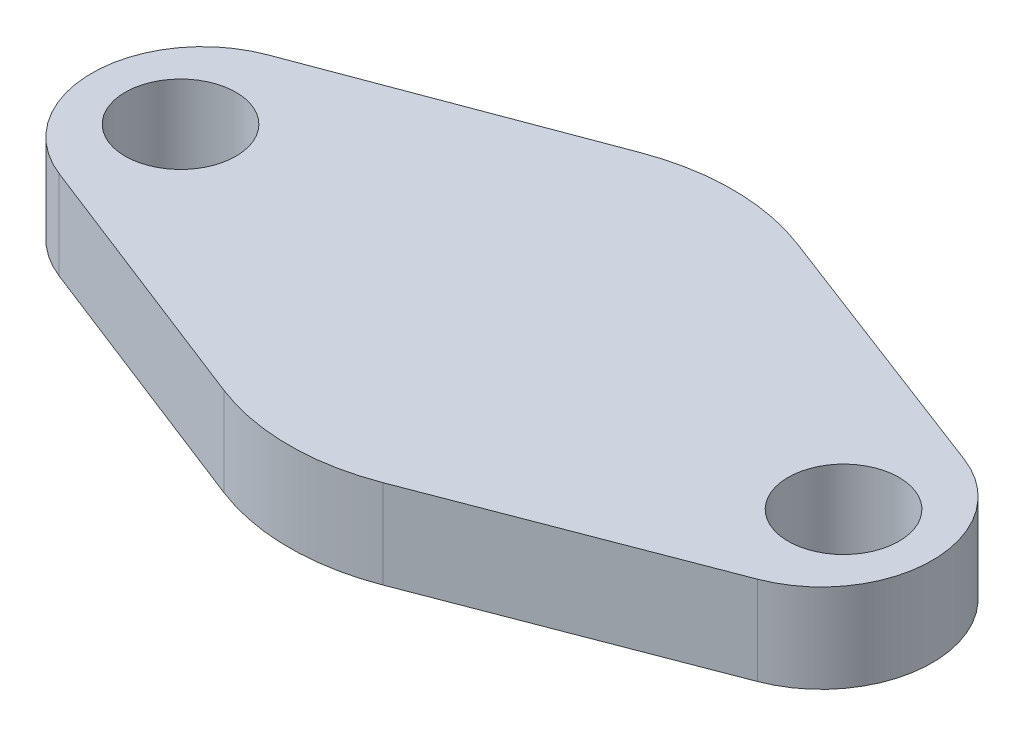
ISO-10303-21;
HEADER;
FILE_DESCRIPTION(('STEP AP214'),'2;1');
FILE_NAME('part.step','',(''),(''),'','','');
FILE_SCHEMA(('AUTOMOTIVE_DESIGN { 1 0 10303 214 1 1 1 1 }'));
ENDSEC;
DATA;
#1=APPLICATION_CONTEXT('core data for automotive mechanical design processes');
#2=APPLICATION_PROTOCOL_DEFINITION('international standard','automotive_design',2000,#1);
#3=PRODUCT_CONTEXT('',#1,'mechanical');
#4=PRODUCT('Part','Part','',(#3));
#5=PRODUCT_RELATED_PRODUCT_CATEGORY('part','',(#4));
#6=PRODUCT_DEFINITION_FORMATION('','',#4);
#7=PRODUCT_DEFINITION_CONTEXT('part definition',#1,'design');
#8=PRODUCT_DEFINITION('design','',#6,#7);
#9=PRODUCT_DEFINITION_SHAPE('','',#8);
#10=(LENGTH_UNIT() NAMED_UNIT(*) SI_UNIT(.MILLI.,.METRE.));
#11=(NAMED_UNIT(*) PLANE_ANGLE_UNIT() SI_UNIT($,.RADIAN.));
#12=(NAMED_UNIT(*) SI_UNIT($,.STERADIAN.) SOLID_ANGLE_UNIT());
#13=UNCERTAINTY_MEASURE_WITH_UNIT(LENGTH_MEASURE(1.E-05),#10,'distance_accuracy_value','');
#14=(GEOMETRIC_REPRESENTATION_CONTEXT(3) GLOBAL_UNCERTAINTY_ASSIGNED_CONTEXT((#13)) GLOBAL_UNIT_ASSIGNED_CONTEXT((#10,
#11,#12)) REPRESENTATION_CONTEXT('',''));
#15=CARTESIAN_POINT('',(0.,0.,0.));
#16=DIRECTION('',(0.,0.,1.));
#17=DIRECTION('',(1.,0.,0.));
#18=AXIS2_PLACEMENT_3D('',#15,#16,#17);
#19=CARTESIAN_POINT('',(69.9999921528156,-20.,-0.0331452222624423));
#20=DIRECTION('',(0.,1.,0.));
#21=DIRECTION('',(0.,0.,1.));
#22=AXIS2_PLACEMENT_3D('',#19,#20,#21);
#23=CYLINDRICAL_SURFACE('',#22,25.);
#24=CARTESIAN_POINT('',(69.9999921528156,0.,-0.0331452222624423));
#25=DIRECTION('',(0.,-1.,0.));
#26=DIRECTION('',(0.,0.,-1.));
#27=AXIS2_PLACEMENT_3D('',#24,#25,#26);
#28=CIRCLE('',#27,25.);
#29=CARTESIAN_POINT('',(78.9175056921311,0.,-23.3886146518441));
#30=VERTEX_POINT('',#29);
#31=CARTESIAN_POINT('',(78.9396194688102,0.,23.3138687934768));
#32=VERTEX_POINT('',#31);
#33=EDGE_CURVE('E139',#30,#32,#28,.T.);
#34=ORIENTED_EDGE('',*,*,#33,.T.);
#35=DIRECTION('',(0.,1.,0.));
#36=VECTOR('',#35,1.);
#37=CARTESIAN_POINT('',(78.9396194688102,-20.,23.3138687934768));
#38=LINE('',#37,#36);
#39=CARTESIAN_POINT('',(78.9396194688102,-20.,23.3138687934768));
#40=VERTEX_POINT('',#39);
#41=EDGE_CURVE('E11',#40,#32,#38,.T.);
#42=ORIENTED_EDGE('',*,*,#41,.F.);
#43=CARTESIAN_POINT('',(69.9999921528156,-20.,-0.0331452222624423));
#44=DIRECTION('',(0.,-1.,0.));
#45=DIRECTION('',(0.,0.,-1.));
#46=AXIS2_PLACEMENT_3D('',#43,#44,#45);
#47=CIRCLE('',#46,25.);
#48=CARTESIAN_POINT('',(78.9175056921311,-20.,-23.3886146518441));
#49=VERTEX_POINT('',#48);
#50=EDGE_CURVE('E162',#49,#40,#47,.T.);
#51=ORIENTED_EDGE('',*,*,#50,.F.);
#52=DIRECTION('',(0.,1.,0.));
#53=VECTOR('',#52,1.);
#54=CARTESIAN_POINT('',(78.9175056921311,-20.,-23.3886146518441));
#55=LINE('',#54,#53);
#56=EDGE_CURVE('E135',#49,#30,#55,.T.);
#57=ORIENTED_EDGE('',*,*,#56,.T.);
#58=EDGE_LOOP('',(#34,#42,#51,#57));
#59=FACE_BOUND('',#58,.T.);
#60=ADVANCED_FACE('F38',(#59),#23,.T.);
#61=CARTESIAN_POINT('',(17.8792546319892,-20.,46.6940280314785));
#62=DIRECTION('',(-0.357585092639783,0.,-0.933880560629569));
#63=DIRECTION('',(-0.933880560629569,0.,0.357585092639783));
#64=AXIS2_PLACEMENT_3D('',#61,#62,#63);
#65=PLANE('',#64);
#66=DIRECTION('',(-0.933880560629569,0.,0.357585092639783));
#67=VECTOR('',#66,1.);
#68=CARTESIAN_POINT('',(17.8792546319892,0.,46.6940280314785));
#69=LINE('',#68,#67);
#70=CARTESIAN_POINT('',(17.8792546319892,0.,46.6940280314785));
#71=VERTEX_POINT('',#70);
#72=EDGE_CURVE('E143',#32,#71,#69,.T.);
#73=ORIENTED_EDGE('',*,*,#72,.T.);
#74=DIRECTION('',(0.,1.,0.));
#75=VECTOR('',#74,1.);
#76=CARTESIAN_POINT('',(17.8792546319892,-20.,46.6940280314785));
#77=LINE('',#76,#75);
#78=CARTESIAN_POINT('',(17.8792546319892,-20.,46.6940280314785));
#79=VERTEX_POINT('',#78);
#80=EDGE_CURVE('E47',#79,#71,#77,.T.);
#81=ORIENTED_EDGE('',*,*,#80,.F.);
#82=DIRECTION('',(-0.933880560629569,0.,0.357585092639783));
#83=VECTOR('',#82,1.);
#84=CARTESIAN_POINT('',(17.8792546319892,-20.,46.6940280314785));
#85=LINE('',#84,#83);
#86=EDGE_CURVE('E98',#40,#79,#85,.T.);
#87=ORIENTED_EDGE('',*,*,#86,.F.);
#88=ORIENTED_EDGE('',*,*,#41,.T.);
#89=EDGE_LOOP('',(#73,#81,#87,#88));
#90=FACE_BOUND('',#89,.T.);
#91=ADVANCED_FACE('F244',(#90),#65,.F.);
#92=CARTESIAN_POINT('',(0.,-20.,0.));
#93=DIRECTION('',(0.,1.,0.));
#94=DIRECTION('',(0.,0.,1.));
#95=AXIS2_PLACEMENT_3D('',#92,#93,#94);
#96=CYLINDRICAL_SURFACE('',#95,50.);
#97=CARTESIAN_POINT('',(0.,0.,0.));
#98=DIRECTION('',(0.,-1.,0.));
#99=DIRECTION('',(0.,0.,-1.));
#100=AXIS2_PLACEMENT_3D('',#97,#98,#99);
#101=CIRCLE('',#100,50.);
#102=CARTESIAN_POINT('',(-18.1568826975564,0.,46.5867750623198));
#103=VERTEX_POINT('',#102);
#104=EDGE_CURVE('E147',#71,#103,#101,.T.);
#105=ORIENTED_EDGE('',*,*,#104,.T.);
#106=DIRECTION('',(0.,1.,0.));
#107=VECTOR('',#106,1.);
#108=CARTESIAN_POINT('',(-18.1568826975564,-20.,46.5867750623198));
#109=LINE('',#108,#107);
#110=CARTESIAN_POINT('',(-18.1568826975564,-20.,46.5867750623198));
#111=VERTEX_POINT('',#110);
#112=EDGE_CURVE('E173',#111,#103,#109,.T.);
#113=ORIENTED_EDGE('',*,*,#112,.F.);
#114=CARTESIAN_POINT('',(0.,-20.,0.));
#115=DIRECTION('',(0.,-1.,0.));
#116=DIRECTION('',(0.,0.,-1.));
#117=AXIS2_PLACEMENT_3D('',#114,#115,#116);
#118=CIRCLE('',#117,50.);
#119=EDGE_CURVE('E183',#79,#111,#118,.T.);
#120=ORIENTED_EDGE('',*,*,#119,.F.);
#121=ORIENTED_EDGE('',*,*,#80,.T.);
#122=EDGE_LOOP('',(#105,#113,#120,#121));
#123=FACE_BOUND('',#122,.T.);
#124=ADVANCED_FACE('F181',(#123),#96,.T.);
#125=CARTESIAN_POINT('',(-79.0769960781902,-20.,22.8435700198086));
#126=DIRECTION('',(0.363137653951129,0.,-0.931735501246395));
#127=DIRECTION('',(-0.931735501246395,0.,-0.363137653951129));
#128=AXIS2_PLACEMENT_3D('',#125,#126,#127);
#129=PLANE('',#128);
#130=DIRECTION('',(-0.931735501246395,0.,-0.363137653951129));
#131=VECTOR('',#130,1.);
#132=CARTESIAN_POINT('',(-79.0769960781902,0.,22.8435700198086));
#133=LINE('',#132,#131);
#134=CARTESIAN_POINT('',(-79.0769960781902,0.,22.8435700198086));
#135=VERTEX_POINT('',#134);
#136=EDGE_CURVE('E150',#103,#135,#133,.T.);
#137=ORIENTED_EDGE('',*,*,#136,.T.);
#138=DIRECTION('',(0.,1.,0.));
#139=VECTOR('',#138,1.);
#140=CARTESIAN_POINT('',(-79.0769960781902,-20.,22.8435700198086));
#141=LINE('',#140,#139);
#142=CARTESIAN_POINT('',(-79.0769960781902,-20.,22.8435700198086));
#143=VERTEX_POINT('',#142);
#144=EDGE_CURVE('E169',#143,#135,#141,.T.);
#145=ORIENTED_EDGE('',*,*,#144,.F.);
#146=DIRECTION('',(-0.931735501246395,0.,-0.363137653951129));
#147=VECTOR('',#146,1.);
#148=CARTESIAN_POINT('',(-79.0769960781902,-20.,22.8435700198086));
#149=LINE('',#148,#147);
#150=EDGE_CURVE('E196',#111,#143,#149,.T.);
#151=ORIENTED_EDGE('',*,*,#150,.F.);
#152=ORIENTED_EDGE('',*,*,#112,.T.);
#153=EDGE_LOOP('',(#137,#145,#151,#152));
#154=FACE_BOUND('',#153,.T.);
#155=ADVANCED_FACE('F191',(#154),#129,.F.);
#156=CARTESIAN_POINT('',(-69.998554729412,-20.,-0.449817511351326));
#157=DIRECTION('',(0.,1.,0.));
#158=DIRECTION('',(0.,0.,1.));
#159=AXIS2_PLACEMENT_3D('',#156,#157,#158);
#160=CYLINDRICAL_SURFACE('',#159,25.);
#161=CARTESIAN_POINT('',(-69.998554729412,0.,-0.449817511351326));
#162=DIRECTION('',(0.,-1.,0.));
#163=DIRECTION('',(0.,0.,-1.));
#164=AXIS2_PLACEMENT_3D('',#161,#162,#163);
#165=CIRCLE('',#164,25.);
#166=CARTESIAN_POINT('',(-78.7768875463001,0.,-23.8579544076518));
#167=VERTEX_POINT('',#166);
#168=EDGE_CURVE('E153',#135,#167,#165,.T.);
#169=ORIENTED_EDGE('',*,*,#168,.T.);
#170=DIRECTION('',(0.,1.,0.));
#171=VECTOR('',#170,1.);
#172=CARTESIAN_POINT('',(-78.7768875463001,-20.,-23.8579544076518));
#173=LINE('',#172,#171);
#174=CARTESIAN_POINT('',(-78.7768875463001,-20.,-23.8579544076518));
#175=VERTEX_POINT('',#174);
#176=EDGE_CURVE('E128',#175,#167,#173,.T.);
#177=ORIENTED_EDGE('',*,*,#176,.F.);
#178=CARTESIAN_POINT('',(-69.998554729412,-20.,-0.449817511351326));
#179=DIRECTION('',(0.,-1.,0.));
#180=DIRECTION('',(0.,0.,-1.));
#181=AXIS2_PLACEMENT_3D('',#178,#179,#180);
#182=CIRCLE('',#181,25.);
#183=EDGE_CURVE('E117',#143,#175,#182,.T.);
#184=ORIENTED_EDGE('',*,*,#183,.F.);
#185=ORIENTED_EDGE('',*,*,#144,.T.);
#186=EDGE_LOOP('',(#169,#177,#184,#185));
#187=FACE_BOUND('',#186,.T.);
#188=ADVANCED_FACE('F194',(#187),#160,.T.);
#189=CARTESIAN_POINT('',(-17.5566656337762,-20.,-46.816273792601));
#190=DIRECTION('',(0.351133312675524,0.,0.93632547585202));
#191=DIRECTION('',(0.93632547585202,0.,-0.351133312675524));
#192=AXIS2_PLACEMENT_3D('',#189,#190,#191);
#193=PLANE('',#192);
#194=DIRECTION('',(0.93632547585202,0.,-0.351133312675524));
#195=VECTOR('',#194,1.);
#196=CARTESIAN_POINT('',(-17.5566656337762,0.,-46.816273792601));
#197=LINE('',#196,#195);
#198=CARTESIAN_POINT('',(-17.5566656337762,0.,-46.816273792601));
#199=VERTEX_POINT('',#198);
#200=EDGE_CURVE('E126',#167,#199,#197,.T.);
#201=ORIENTED_EDGE('',*,*,#200,.T.);
#202=DIRECTION('',(0.,1.,0.));
#203=VECTOR('',#202,1.);
#204=CARTESIAN_POINT('',(-17.5566656337762,-20.,-46.816273792601));
#205=LINE('',#204,#203);
#206=CARTESIAN_POINT('',(-17.5566656337762,-20.,-46.816273792601));
#207=VERTEX_POINT('',#206);
#208=EDGE_CURVE('E123',#207,#199,#205,.T.);
#209=ORIENTED_EDGE('',*,*,#208,.F.);
#210=DIRECTION('',(0.93632547585202,0.,-0.351133312675524));
#211=VECTOR('',#210,1.);
#212=CARTESIAN_POINT('',(-17.5566656337762,-20.,-46.816273792601));
#213=LINE('',#212,#211);
#214=EDGE_CURVE('E111',#175,#207,#213,.T.);
#215=ORIENTED_EDGE('',*,*,#214,.F.);
#216=ORIENTED_EDGE('',*,*,#176,.T.);
#217=EDGE_LOOP('',(#201,#209,#215,#216));
#218=FACE_BOUND('',#217,.T.);
#219=ADVANCED_FACE('F124',(#218),#193,.F.);
#220=CARTESIAN_POINT('',(0.,-20.,0.));
#221=DIRECTION('',(0.,1.,0.));
#222=DIRECTION('',(0.,0.,1.));
#223=AXIS2_PLACEMENT_3D('',#220,#221,#222);
#224=CYLINDRICAL_SURFACE('',#223,50.);
#225=CARTESIAN_POINT('',(0.,0.,0.));
#226=DIRECTION('',(0.,-1.,0.));
#227=DIRECTION('',(0.,0.,-1.));
#228=AXIS2_PLACEMENT_3D('',#225,#226,#227);
#229=CIRCLE('',#228,50.);
#230=CARTESIAN_POINT('',(17.835027078631,0.,-46.7109388591634));
#231=VERTEX_POINT('',#230);
#232=EDGE_CURVE('E84',#199,#231,#229,.T.);
#233=ORIENTED_EDGE('',*,*,#232,.T.);
#234=DIRECTION('',(0.,1.,0.));
#235=VECTOR('',#234,1.);
#236=CARTESIAN_POINT('',(17.835027078631,-20.,-46.7109388591634));
#237=LINE('',#236,#235);
#238=CARTESIAN_POINT('',(17.835027078631,-20.,-46.7109388591634));
#239=VERTEX_POINT('',#238);
#240=EDGE_CURVE('E129',#239,#231,#237,.T.);
#241=ORIENTED_EDGE('',*,*,#240,.F.);
#242=CARTESIAN_POINT('',(0.,-20.,0.));
#243=DIRECTION('',(0.,-1.,0.));
#244=DIRECTION('',(0.,0.,-1.));
#245=AXIS2_PLACEMENT_3D('',#242,#243,#244);
#246=CIRCLE('',#245,50.);
#247=EDGE_CURVE('E115',#207,#239,#246,.T.);
#248=ORIENTED_EDGE('',*,*,#247,.F.);
#249=ORIENTED_EDGE('',*,*,#208,.T.);
#250=EDGE_LOOP('',(#233,#241,#248,#249));
#251=FACE_BOUND('',#250,.T.);
#252=ADVANCED_FACE('F131',(#251),#224,.T.);
#253=CARTESIAN_POINT('',(78.9175056921311,-20.,-23.3886146518441));
#254=DIRECTION('',(-0.35670054157262,0.,0.934218777183267));
#255=DIRECTION('',(0.934218777183267,0.,0.35670054157262));
#256=AXIS2_PLACEMENT_3D('',#253,#254,#255);
#257=PLANE('',#256);
#258=DIRECTION('',(0.934218777183267,0.,0.35670054157262));
#259=VECTOR('',#258,1.);
#260=CARTESIAN_POINT('',(78.9175056921311,0.,-23.3886146518441));
#261=LINE('',#260,#259);
#262=EDGE_CURVE('E90',#231,#30,#261,.T.);
#263=ORIENTED_EDGE('',*,*,#262,.T.);
#264=ORIENTED_EDGE('',*,*,#56,.F.);
#265=DIRECTION('',(0.934218777183267,0.,0.35670054157262));
#266=VECTOR('',#265,1.);
#267=CARTESIAN_POINT('',(78.9175056921311,-20.,-23.3886146518441));
#268=LINE('',#267,#266);
#269=EDGE_CURVE('E55',#239,#49,#268,.T.);
#270=ORIENTED_EDGE('',*,*,#269,.F.);
#271=ORIENTED_EDGE('',*,*,#240,.T.);
#272=EDGE_LOOP('',(#263,#264,#270,#271));
#273=FACE_BOUND('',#272,.T.);
#274=ADVANCED_FACE('F251',(#273),#257,.F.);
#275=CARTESIAN_POINT('',(69.9999921528156,-20.,-0.0331452222624423));
#276=DIRECTION('',(0.,-1.,0.));
#277=DIRECTION('',(0.,0.,-1.));
#278=AXIS2_PLACEMENT_3D('',#275,#276,#277);
#279=PLANE('',#278);
#280=CARTESIAN_POINT('',(-74.9980385613448,-20.,-0.481944680033792));
#281=DIRECTION('',(0.,1.,0.));
#282=DIRECTION('',(0.,0.,1.));
#283=AXIS2_PLACEMENT_3D('',#280,#281,#282);
#284=CIRCLE('',#283,12.5);
#285=CARTESIAN_POINT('',(-74.9980385613448,-20.,12.0180553199662));
#286=VERTEX_POINT('',#285);
#287=EDGE_CURVE('E144',#286,#286,#284,.T.);
#288=ORIENTED_EDGE('',*,*,#287,.T.);
#289=EDGE_LOOP('',(#288));
#290=FACE_BOUND('',#289,.T.);
#291=CARTESIAN_POINT('',(74.999578649369,-20.,-0.0355125426085293));
#292=DIRECTION('',(0.,1.,0.));
#293=DIRECTION('',(0.,0.,-1.));
#294=AXIS2_PLACEMENT_3D('',#291,#292,#293);
#295=CIRCLE('',#294,12.5);
#296=CARTESIAN_POINT('',(74.999578649369,-20.,-12.5355125426086));
#297=VERTEX_POINT('',#296);
#298=EDGE_CURVE('E210',#297,#297,#295,.T.);
#299=ORIENTED_EDGE('',*,*,#298,.T.);
#300=EDGE_LOOP('',(#299));
#301=FACE_BOUND('',#300,.T.);
#302=ORIENTED_EDGE('',*,*,#50,.T.);
#303=ORIENTED_EDGE('',*,*,#86,.T.);
#304=ORIENTED_EDGE('',*,*,#119,.T.);
#305=ORIENTED_EDGE('',*,*,#150,.T.);
#306=ORIENTED_EDGE('',*,*,#183,.T.);
#307=ORIENTED_EDGE('',*,*,#214,.T.);
#308=ORIENTED_EDGE('',*,*,#247,.T.);
#309=ORIENTED_EDGE('',*,*,#269,.T.);
#310=EDGE_LOOP('',(#302,#303,#304,#305,#306,#307,#308,#309));
#311=FACE_BOUND('',#310,.T.);
#312=ADVANCED_FACE('F113',(#290,#301,#311),#279,.T.);
#313=CARTESIAN_POINT('',(69.9999921528156,0.,-0.0331452222624423));
#314=DIRECTION('',(0.,-1.,0.));
#315=DIRECTION('',(0.,0.,-1.));
#316=AXIS2_PLACEMENT_3D('',#313,#314,#315);
#317=PLANE('',#316);
#318=CARTESIAN_POINT('',(-74.9980385613448,0.,-0.481944680033792));
#319=DIRECTION('',(0.,1.,0.));
#320=DIRECTION('',(0.,0.,1.));
#321=AXIS2_PLACEMENT_3D('',#318,#319,#320);
#322=CIRCLE('',#321,12.5);
#323=CARTESIAN_POINT('',(-74.9980385613448,0.,12.0180553199662));
#324=VERTEX_POINT('',#323);
#325=EDGE_CURVE('E214',#324,#324,#322,.T.);
#326=ORIENTED_EDGE('',*,*,#325,.F.);
#327=EDGE_LOOP('',(#326));
#328=FACE_BOUND('',#327,.T.);
#329=CARTESIAN_POINT('',(74.999578649369,0.,-0.0355125426085293));
#330=DIRECTION('',(0.,1.,0.));
#331=DIRECTION('',(0.,0.,-1.));
#332=AXIS2_PLACEMENT_3D('',#329,#330,#331);
#333=CIRCLE('',#332,12.5);
#334=CARTESIAN_POINT('',(74.999578649369,0.,-12.5355125426086));
#335=VERTEX_POINT('',#334);
#336=EDGE_CURVE('E206',#335,#335,#333,.T.);
#337=ORIENTED_EDGE('',*,*,#336,.F.);
#338=EDGE_LOOP('',(#337));
#339=FACE_BOUND('',#338,.T.);
#340=ORIENTED_EDGE('',*,*,#33,.F.);
#341=ORIENTED_EDGE('',*,*,#262,.F.);
#342=ORIENTED_EDGE('',*,*,#232,.F.);
#343=ORIENTED_EDGE('',*,*,#200,.F.);
#344=ORIENTED_EDGE('',*,*,#168,.F.);
#345=ORIENTED_EDGE('',*,*,#136,.F.);
#346=ORIENTED_EDGE('',*,*,#104,.F.);
#347=ORIENTED_EDGE('',*,*,#72,.F.);
#348=EDGE_LOOP('',(#340,#341,#342,#343,#344,#345,#346,#347));
#349=FACE_BOUND('',#348,.T.);
#350=ADVANCED_FACE('F187',(#328,#339,#349),#317,.F.);
#351=CARTESIAN_POINT('',(74.999578649369,-20.,-0.0355125426085293));
#352=DIRECTION('',(0.,1.,0.));
#353=DIRECTION('',(0.,0.,1.));
#354=AXIS2_PLACEMENT_3D('',#351,#352,#353);
#355=CYLINDRICAL_SURFACE('',#354,12.5);
#356=ORIENTED_EDGE('',*,*,#298,.F.);
#357=EDGE_LOOP('',(#356));
#358=FACE_BOUND('',#357,.T.);
#359=ORIENTED_EDGE('',*,*,#336,.T.);
#360=EDGE_LOOP('',(#359));
#361=FACE_BOUND('',#360,.T.);
#362=ADVANCED_FACE('F227',(#358,#361),#355,.F.);
#363=CARTESIAN_POINT('',(-74.9980385613448,-20.,-0.481944680033792));
#364=DIRECTION('',(0.,1.,0.));
#365=DIRECTION('',(0.,0.,1.));
#366=AXIS2_PLACEMENT_3D('',#363,#364,#365);
#367=CYLINDRICAL_SURFACE('',#366,12.5);
#368=ORIENTED_EDGE('',*,*,#287,.F.);
#369=EDGE_LOOP('',(#368));
#370=FACE_BOUND('',#369,.T.);
#371=ORIENTED_EDGE('',*,*,#325,.T.);
#372=EDGE_LOOP('',(#371));
#373=FACE_BOUND('',#372,.T.);
#374=ADVANCED_FACE('F224',(#370,#373),#367,.F.);
#375=CLOSED_SHELL('',(#60,#91,#124,#155,#188,#219,#252,#274,#312,#350,#362,#374));
#376=MANIFOLD_SOLID_BREP('B2',#375);
#377=ADVANCED_BREP_SHAPE_REPRESENTATION('',(#18,#376),#14);
#378=SHAPE_DEFINITION_REPRESENTATION(#9,#377);
ENDSEC;
END-ISO-10303-21;
